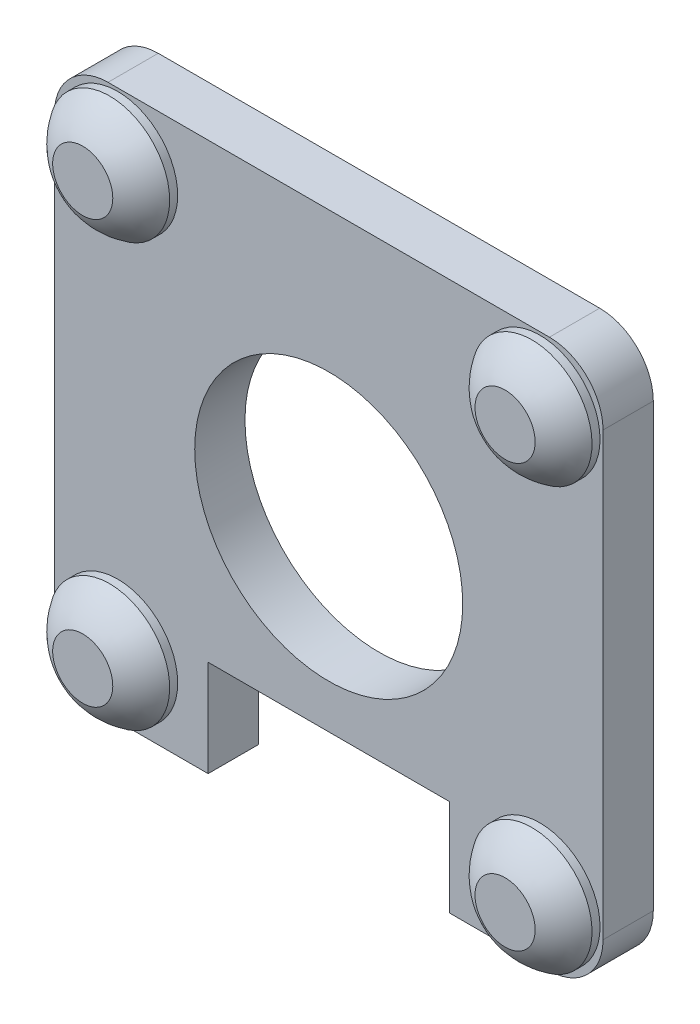
ISO-10303-21;
HEADER;
FILE_DESCRIPTION(('STEP AP214'),'2;1');
FILE_NAME('part.step','',(''),(''),'','','');
FILE_SCHEMA(('AUTOMOTIVE_DESIGN { 1 0 10303 214 1 1 1 1 }'));
ENDSEC;
DATA;
#1=APPLICATION_CONTEXT('core data for automotive mechanical design processes');
#2=APPLICATION_PROTOCOL_DEFINITION('international standard','automotive_design',2000,#1);
#3=PRODUCT_CONTEXT('',#1,'mechanical');
#4=PRODUCT('Part','Part','',(#3));
#5=PRODUCT_RELATED_PRODUCT_CATEGORY('part','',(#4));
#6=PRODUCT_DEFINITION_FORMATION('','',#4);
#7=PRODUCT_DEFINITION_CONTEXT('part definition',#1,'design');
#8=PRODUCT_DEFINITION('design','',#6,#7);
#9=PRODUCT_DEFINITION_SHAPE('','',#8);
#10=(LENGTH_UNIT() NAMED_UNIT(*) SI_UNIT(.MILLI.,.METRE.));
#11=(NAMED_UNIT(*) PLANE_ANGLE_UNIT() SI_UNIT($,.RADIAN.));
#12=(NAMED_UNIT(*) SI_UNIT($,.STERADIAN.) SOLID_ANGLE_UNIT());
#13=UNCERTAINTY_MEASURE_WITH_UNIT(LENGTH_MEASURE(1.E-05),#10,'distance_accuracy_value','');
#14=(GEOMETRIC_REPRESENTATION_CONTEXT(3) GLOBAL_UNCERTAINTY_ASSIGNED_CONTEXT((#13)) GLOBAL_UNIT_ASSIGNED_CONTEXT((#10,
#11,#12)) REPRESENTATION_CONTEXT('',''));
#15=CARTESIAN_POINT('',(0.,0.,0.));
#16=DIRECTION('',(0.,0.,1.));
#17=DIRECTION('',(1.,0.,0.));
#18=AXIS2_PLACEMENT_3D('',#15,#16,#17);
#19=CARTESIAN_POINT('',(-13.,-13.,2.38125));
#20=DIRECTION('',(0.,1.,0.));
#21=DIRECTION('',(0.,0.,1.));
#22=AXIS2_PLACEMENT_3D('',#19,#20,#21);
#23=PLANE('',#22);
#24=DIRECTION('',(1.,0.,0.));
#25=VECTOR('',#24,1.);
#26=CARTESIAN_POINT('',(-13.,-13.,2.38125));
#27=LINE('',#26,#25);
#28=CARTESIAN_POINT('',(5.715,-13.,2.38125));
#29=VERTEX_POINT('',#28);
#30=CARTESIAN_POINT('',(10.46,-13.,2.38125));
#31=VERTEX_POINT('',#30);
#32=EDGE_CURVE('E186',#29,#31,#27,.T.);
#33=ORIENTED_EDGE('',*,*,#32,.F.);
#34=DIRECTION('',(0.,0.,1.));
#35=VECTOR('',#34,1.);
#36=CARTESIAN_POINT('',(5.715,-13.,0.));
#37=LINE('',#36,#35);
#38=CARTESIAN_POINT('',(5.715,-13.,0.));
#39=VERTEX_POINT('',#38);
#40=EDGE_CURVE('E123',#39,#29,#37,.T.);
#41=ORIENTED_EDGE('',*,*,#40,.F.);
#42=DIRECTION('',(1.,0.,0.));
#43=VECTOR('',#42,1.);
#44=CARTESIAN_POINT('',(-13.,-13.,0.));
#45=LINE('',#44,#43);
#46=CARTESIAN_POINT('',(10.46,-13.,0.));
#47=VERTEX_POINT('',#46);
#48=EDGE_CURVE('E174',#39,#47,#45,.T.);
#49=ORIENTED_EDGE('',*,*,#48,.T.);
#50=DIRECTION('',(0.,0.,-1.));
#51=VECTOR('',#50,1.);
#52=CARTESIAN_POINT('',(10.46,-13.,2.38125));
#53=LINE('',#52,#51);
#54=EDGE_CURVE('E211',#47,#31,#53,.F.);
#55=ORIENTED_EDGE('',*,*,#54,.T.);
#56=EDGE_LOOP('',(#33,#41,#49,#55));
#57=FACE_BOUND('',#56,.T.);
#58=ADVANCED_FACE('F16',(#57),#23,.F.);
#59=CARTESIAN_POINT('',(-13.,13.,2.38125));
#60=DIRECTION('',(1.,0.,0.));
#61=DIRECTION('',(0.,1.,0.));
#62=AXIS2_PLACEMENT_3D('',#59,#60,#61);
#63=PLANE('',#62);
#64=DIRECTION('',(0.,-1.,0.));
#65=VECTOR('',#64,1.);
#66=CARTESIAN_POINT('',(-13.,13.,0.));
#67=LINE('',#66,#65);
#68=CARTESIAN_POINT('',(-13.,10.46,0.));
#69=VERTEX_POINT('',#68);
#70=CARTESIAN_POINT('',(-13.,-10.46,0.));
#71=VERTEX_POINT('',#70);
#72=EDGE_CURVE('E171',#69,#71,#67,.T.);
#73=ORIENTED_EDGE('',*,*,#72,.T.);
#74=DIRECTION('',(0.,0.,-1.));
#75=VECTOR('',#74,1.);
#76=CARTESIAN_POINT('',(-13.,-10.46,2.38125));
#77=LINE('',#76,#75);
#78=CARTESIAN_POINT('',(-13.,-10.46,2.38125));
#79=VERTEX_POINT('',#78);
#80=EDGE_CURVE('E225',#71,#79,#77,.F.);
#81=ORIENTED_EDGE('',*,*,#80,.T.);
#82=DIRECTION('',(0.,-1.,0.));
#83=VECTOR('',#82,1.);
#84=CARTESIAN_POINT('',(-13.,13.,2.38125));
#85=LINE('',#84,#83);
#86=CARTESIAN_POINT('',(-13.,10.46,2.38125));
#87=VERTEX_POINT('',#86);
#88=EDGE_CURVE('E183',#87,#79,#85,.T.);
#89=ORIENTED_EDGE('',*,*,#88,.F.);
#90=DIRECTION('',(0.,0.,-1.));
#91=VECTOR('',#90,1.);
#92=CARTESIAN_POINT('',(-13.,10.46,2.38125));
#93=LINE('',#92,#91);
#94=EDGE_CURVE('E222',#87,#69,#93,.T.);
#95=ORIENTED_EDGE('',*,*,#94,.T.);
#96=EDGE_LOOP('',(#73,#81,#89,#95));
#97=FACE_BOUND('',#96,.T.);
#98=ADVANCED_FACE('F18',(#97),#63,.F.);
#99=CARTESIAN_POINT('',(-10.46,-13.,0.));
#100=VERTEX_POINT('',#99);
#101=CARTESIAN_POINT('',(-5.715,-13.,0.));
#102=VERTEX_POINT('',#101);
#103=EDGE_CURVE('E175',#100,#102,#45,.T.);
#104=ORIENTED_EDGE('',*,*,#103,.T.);
#105=DIRECTION('',(0.,0.,1.));
#106=VECTOR('',#105,1.);
#107=CARTESIAN_POINT('',(-5.715,-13.,0.));
#108=LINE('',#107,#106);
#109=CARTESIAN_POINT('',(-5.715,-13.,2.38125));
#110=VERTEX_POINT('',#109);
#111=EDGE_CURVE('E140',#102,#110,#108,.T.);
#112=ORIENTED_EDGE('',*,*,#111,.T.);
#113=CARTESIAN_POINT('',(-10.46,-13.,2.38125));
#114=VERTEX_POINT('',#113);
#115=EDGE_CURVE('E187',#114,#110,#27,.T.);
#116=ORIENTED_EDGE('',*,*,#115,.F.);
#117=DIRECTION('',(0.,0.,-1.));
#118=VECTOR('',#117,1.);
#119=CARTESIAN_POINT('',(-10.46,-13.,2.38125));
#120=LINE('',#119,#118);
#121=EDGE_CURVE('E208',#114,#100,#120,.T.);
#122=ORIENTED_EDGE('',*,*,#121,.T.);
#123=EDGE_LOOP('',(#104,#112,#116,#122));
#124=FACE_BOUND('',#123,.T.);
#125=ADVANCED_FACE('F277',(#124),#23,.F.);
#126=CARTESIAN_POINT('',(13.,13.,2.38125));
#127=DIRECTION('',(-1.,0.,0.));
#128=DIRECTION('',(0.,-1.,0.));
#129=AXIS2_PLACEMENT_3D('',#126,#127,#128);
#130=PLANE('',#129);
#131=DIRECTION('',(0.,1.,0.));
#132=VECTOR('',#131,1.);
#133=CARTESIAN_POINT('',(13.,13.,2.38125));
#134=LINE('',#133,#132);
#135=CARTESIAN_POINT('',(13.,-10.46,2.38125));
#136=VERTEX_POINT('',#135);
#137=CARTESIAN_POINT('',(13.,10.46,2.38125));
#138=VERTEX_POINT('',#137);
#139=EDGE_CURVE('E189',#136,#138,#134,.T.);
#140=ORIENTED_EDGE('',*,*,#139,.F.);
#141=DIRECTION('',(0.,0.,-1.));
#142=VECTOR('',#141,1.);
#143=CARTESIAN_POINT('',(13.,-10.46,2.38125));
#144=LINE('',#143,#142);
#145=CARTESIAN_POINT('',(13.,-10.46,0.));
#146=VERTEX_POINT('',#145);
#147=EDGE_CURVE('E196',#136,#146,#144,.T.);
#148=ORIENTED_EDGE('',*,*,#147,.T.);
#149=DIRECTION('',(0.,1.,0.));
#150=VECTOR('',#149,1.);
#151=CARTESIAN_POINT('',(13.,13.,0.));
#152=LINE('',#151,#150);
#153=CARTESIAN_POINT('',(13.,10.46,0.));
#154=VERTEX_POINT('',#153);
#155=EDGE_CURVE('E178',#146,#154,#152,.T.);
#156=ORIENTED_EDGE('',*,*,#155,.T.);
#157=DIRECTION('',(0.,0.,-1.));
#158=VECTOR('',#157,1.);
#159=CARTESIAN_POINT('',(13.,10.46,2.38125));
#160=LINE('',#159,#158);
#161=EDGE_CURVE('E194',#154,#138,#160,.F.);
#162=ORIENTED_EDGE('',*,*,#161,.T.);
#163=EDGE_LOOP('',(#140,#148,#156,#162));
#164=FACE_BOUND('',#163,.T.);
#165=ADVANCED_FACE('F284',(#164),#130,.F.);
#166=CARTESIAN_POINT('',(-13.,13.,2.38125));
#167=DIRECTION('',(0.,-1.,0.));
#168=DIRECTION('',(0.,0.,-1.));
#169=AXIS2_PLACEMENT_3D('',#166,#167,#168);
#170=PLANE('',#169);
#171=DIRECTION('',(-1.,0.,0.));
#172=VECTOR('',#171,1.);
#173=CARTESIAN_POINT('',(-13.,13.,0.));
#174=LINE('',#173,#172);
#175=CARTESIAN_POINT('',(10.46,13.,0.));
#176=VERTEX_POINT('',#175);
#177=CARTESIAN_POINT('',(-10.46,13.,0.));
#178=VERTEX_POINT('',#177);
#179=EDGE_CURVE('E181',#176,#178,#174,.T.);
#180=ORIENTED_EDGE('',*,*,#179,.T.);
#181=DIRECTION('',(0.,0.,-1.));
#182=VECTOR('',#181,1.);
#183=CARTESIAN_POINT('',(-10.46,13.,2.38125));
#184=LINE('',#183,#182);
#185=CARTESIAN_POINT('',(-10.46,13.,2.38125));
#186=VERTEX_POINT('',#185);
#187=EDGE_CURVE('E39',#178,#186,#184,.F.);
#188=ORIENTED_EDGE('',*,*,#187,.T.);
#189=DIRECTION('',(-1.,0.,0.));
#190=VECTOR('',#189,1.);
#191=CARTESIAN_POINT('',(-13.,13.,2.38125));
#192=LINE('',#191,#190);
#193=CARTESIAN_POINT('',(10.46,13.,2.38125));
#194=VERTEX_POINT('',#193);
#195=EDGE_CURVE('E192',#194,#186,#192,.T.);
#196=ORIENTED_EDGE('',*,*,#195,.F.);
#197=DIRECTION('',(0.,0.,-1.));
#198=VECTOR('',#197,1.);
#199=CARTESIAN_POINT('',(10.46,13.,2.38125));
#200=LINE('',#199,#198);
#201=EDGE_CURVE('E227',#194,#176,#200,.T.);
#202=ORIENTED_EDGE('',*,*,#201,.T.);
#203=EDGE_LOOP('',(#180,#188,#196,#202));
#204=FACE_BOUND('',#203,.T.);
#205=ADVANCED_FACE('F247',(#204),#170,.F.);
#206=CARTESIAN_POINT('',(-13.,-13.,2.38125));
#207=DIRECTION('',(0.,0.,1.));
#208=DIRECTION('',(1.,0.,0.));
#209=AXIS2_PLACEMENT_3D('',#206,#207,#208);
#210=PLANE('',#209);
#211=DIRECTION('',(0.,1.,0.));
#212=VECTOR('',#211,1.);
#213=CARTESIAN_POINT('',(5.715,-13.,2.38125));
#214=LINE('',#213,#212);
#215=CARTESIAN_POINT('',(5.715,-8.428,2.38125));
#216=VERTEX_POINT('',#215);
#217=EDGE_CURVE('E120',#29,#216,#214,.T.);
#218=ORIENTED_EDGE('',*,*,#217,.F.);
#219=ORIENTED_EDGE('',*,*,#32,.T.);
#220=CARTESIAN_POINT('',(10.46,-10.46,2.38125));
#221=DIRECTION('',(0.,0.,1.));
#222=DIRECTION('',(1.,0.,0.));
#223=AXIS2_PLACEMENT_3D('',#220,#221,#222);
#224=CIRCLE('',#223,2.54);
#225=EDGE_CURVE('E220',#31,#136,#224,.T.);
#226=ORIENTED_EDGE('',*,*,#225,.T.);
#227=ORIENTED_EDGE('',*,*,#139,.T.);
#228=CARTESIAN_POINT('',(10.46,10.46,2.38125));
#229=DIRECTION('',(0.,0.,1.));
#230=DIRECTION('',(1.,0.,0.));
#231=AXIS2_PLACEMENT_3D('',#228,#229,#230);
#232=CIRCLE('',#231,2.54);
#233=EDGE_CURVE('E214',#138,#194,#232,.T.);
#234=ORIENTED_EDGE('',*,*,#233,.T.);
#235=ORIENTED_EDGE('',*,*,#195,.T.);
#236=CARTESIAN_POINT('',(-10.46,10.46,2.38125));
#237=DIRECTION('',(0.,0.,1.));
#238=DIRECTION('',(1.,0.,0.));
#239=AXIS2_PLACEMENT_3D('',#236,#237,#238);
#240=CIRCLE('',#239,2.54);
#241=EDGE_CURVE('E216',#186,#87,#240,.T.);
#242=ORIENTED_EDGE('',*,*,#241,.T.);
#243=ORIENTED_EDGE('',*,*,#88,.T.);
#244=CARTESIAN_POINT('',(-10.46,-10.46,2.38125));
#245=DIRECTION('',(0.,0.,1.));
#246=DIRECTION('',(1.,0.,0.));
#247=AXIS2_PLACEMENT_3D('',#244,#245,#246);
#248=CIRCLE('',#247,2.54);
#249=EDGE_CURVE('E218',#79,#114,#248,.T.);
#250=ORIENTED_EDGE('',*,*,#249,.T.);
#251=ORIENTED_EDGE('',*,*,#115,.T.);
#252=DIRECTION('',(0.,-1.,0.));
#253=VECTOR('',#252,1.);
#254=CARTESIAN_POINT('',(-5.715,-13.,2.38125));
#255=LINE('',#254,#253);
#256=CARTESIAN_POINT('',(-5.715,-8.428,2.38125));
#257=VERTEX_POINT('',#256);
#258=EDGE_CURVE('E130',#257,#110,#255,.T.);
#259=ORIENTED_EDGE('',*,*,#258,.F.);
#260=DIRECTION('',(-1.,0.,0.));
#261=VECTOR('',#260,1.);
#262=CARTESIAN_POINT('',(5.715,-8.428,2.38125));
#263=LINE('',#262,#261);
#264=EDGE_CURVE('E111',#216,#257,#263,.T.);
#265=ORIENTED_EDGE('',*,*,#264,.F.);
#266=EDGE_LOOP('',(#218,#219,#226,#227,#234,#235,#242,#243,#250,#251,#259,#265));
#267=FACE_BOUND('',#266,.T.);
#268=CARTESIAN_POINT('',(10.0075999999999,10.0076000000001,2.38125));
#269=DIRECTION('',(0.,0.,1.));
#270=DIRECTION('',(1.,0.,0.));
#271=AXIS2_PLACEMENT_3D('',#268,#269,#270);
#272=CIRCLE('',#271,2.85);
#273=CARTESIAN_POINT('',(12.8575999999999,10.0076000000001,2.38125));
#274=VERTEX_POINT('',#273);
#275=EDGE_CURVE('E11',#274,#274,#272,.T.);
#276=ORIENTED_EDGE('',*,*,#275,.F.);
#277=EDGE_LOOP('',(#276));
#278=FACE_BOUND('',#277,.T.);
#279=CARTESIAN_POINT('',(10.0076000000001,-10.0075999999999,2.38125));
#280=DIRECTION('',(0.,0.,1.));
#281=DIRECTION('',(1.,0.,0.));
#282=AXIS2_PLACEMENT_3D('',#279,#280,#281);
#283=CIRCLE('',#282,2.85);
#284=CARTESIAN_POINT('',(12.8576000000001,-10.0075999999999,2.38125));
#285=VERTEX_POINT('',#284);
#286=EDGE_CURVE('E24',#285,#285,#283,.T.);
#287=ORIENTED_EDGE('',*,*,#286,.F.);
#288=EDGE_LOOP('',(#287));
#289=FACE_BOUND('',#288,.T.);
#290=CARTESIAN_POINT('',(-10.0076,-10.0076,2.38125));
#291=DIRECTION('',(0.,0.,1.));
#292=DIRECTION('',(1.,0.,0.));
#293=AXIS2_PLACEMENT_3D('',#290,#291,#292);
#294=CIRCLE('',#293,2.85);
#295=CARTESIAN_POINT('',(-7.15759999999997,-10.0076,2.38125));
#296=VERTEX_POINT('',#295);
#297=EDGE_CURVE('E236',#296,#296,#294,.T.);
#298=ORIENTED_EDGE('',*,*,#297,.F.);
#299=EDGE_LOOP('',(#298));
#300=FACE_BOUND('',#299,.T.);
#301=CARTESIAN_POINT('',(-10.0076,10.0076,2.38125));
#302=DIRECTION('',(0.,0.,1.));
#303=DIRECTION('',(1.,0.,0.));
#304=AXIS2_PLACEMENT_3D('',#301,#302,#303);
#305=CIRCLE('',#304,2.85);
#306=CARTESIAN_POINT('',(-7.1576,10.0076,2.38125));
#307=VERTEX_POINT('',#306);
#308=EDGE_CURVE('E231',#307,#307,#305,.T.);
#309=ORIENTED_EDGE('',*,*,#308,.F.);
#310=EDGE_LOOP('',(#309));
#311=FACE_BOUND('',#310,.T.);
#312=CARTESIAN_POINT('',(0.,0.,2.38125));
#313=DIRECTION('',(0.,0.,1.));
#314=DIRECTION('',(1.,0.,0.));
#315=AXIS2_PLACEMENT_3D('',#312,#313,#314);
#316=CIRCLE('',#315,6.35);
#317=CARTESIAN_POINT('',(6.35,0.,2.38125));
#318=VERTEX_POINT('',#317);
#319=EDGE_CURVE('E167',#318,#318,#316,.T.);
#320=ORIENTED_EDGE('',*,*,#319,.F.);
#321=EDGE_LOOP('',(#320));
#322=FACE_BOUND('',#321,.T.);
#323=ADVANCED_FACE('F127',(#267,#278,#289,#300,#311,#322),#210,.T.);
#324=CARTESIAN_POINT('',(-13.,-13.,0.));
#325=DIRECTION('',(0.,0.,1.));
#326=DIRECTION('',(1.,0.,0.));
#327=AXIS2_PLACEMENT_3D('',#324,#325,#326);
#328=PLANE('',#327);
#329=ORIENTED_EDGE('',*,*,#48,.F.);
#330=DIRECTION('',(0.,1.,0.));
#331=VECTOR('',#330,1.);
#332=CARTESIAN_POINT('',(5.715,-13.,0.));
#333=LINE('',#332,#331);
#334=CARTESIAN_POINT('',(5.715,-8.428,0.));
#335=VERTEX_POINT('',#334);
#336=EDGE_CURVE('E132',#39,#335,#333,.T.);
#337=ORIENTED_EDGE('',*,*,#336,.T.);
#338=DIRECTION('',(-1.,0.,0.));
#339=VECTOR('',#338,1.);
#340=CARTESIAN_POINT('',(5.715,-8.428,0.));
#341=LINE('',#340,#339);
#342=CARTESIAN_POINT('',(-5.715,-8.428,0.));
#343=VERTEX_POINT('',#342);
#344=EDGE_CURVE('E114',#335,#343,#341,.T.);
#345=ORIENTED_EDGE('',*,*,#344,.T.);
#346=DIRECTION('',(0.,-1.,0.));
#347=VECTOR('',#346,1.);
#348=CARTESIAN_POINT('',(-5.715,-13.,0.));
#349=LINE('',#348,#347);
#350=EDGE_CURVE('E31',#343,#102,#349,.T.);
#351=ORIENTED_EDGE('',*,*,#350,.T.);
#352=ORIENTED_EDGE('',*,*,#103,.F.);
#353=CARTESIAN_POINT('',(-10.46,-10.46,0.));
#354=DIRECTION('',(0.,0.,1.));
#355=DIRECTION('',(1.,0.,0.));
#356=AXIS2_PLACEMENT_3D('',#353,#354,#355);
#357=CIRCLE('',#356,2.54);
#358=EDGE_CURVE('E203',#100,#71,#357,.F.);
#359=ORIENTED_EDGE('',*,*,#358,.T.);
#360=ORIENTED_EDGE('',*,*,#72,.F.);
#361=CARTESIAN_POINT('',(-10.46,10.46,0.));
#362=DIRECTION('',(0.,0.,1.));
#363=DIRECTION('',(1.,0.,0.));
#364=AXIS2_PLACEMENT_3D('',#361,#362,#363);
#365=CIRCLE('',#364,2.54);
#366=EDGE_CURVE('E201',#69,#178,#365,.F.);
#367=ORIENTED_EDGE('',*,*,#366,.T.);
#368=ORIENTED_EDGE('',*,*,#179,.F.);
#369=CARTESIAN_POINT('',(10.46,10.46,0.));
#370=DIRECTION('',(0.,0.,1.));
#371=DIRECTION('',(1.,0.,0.));
#372=AXIS2_PLACEMENT_3D('',#369,#370,#371);
#373=CIRCLE('',#372,2.54);
#374=EDGE_CURVE('E199',#176,#154,#373,.F.);
#375=ORIENTED_EDGE('',*,*,#374,.T.);
#376=ORIENTED_EDGE('',*,*,#155,.F.);
#377=CARTESIAN_POINT('',(10.46,-10.46,0.));
#378=DIRECTION('',(0.,0.,1.));
#379=DIRECTION('',(1.,0.,0.));
#380=AXIS2_PLACEMENT_3D('',#377,#378,#379);
#381=CIRCLE('',#380,2.54);
#382=EDGE_CURVE('E205',#146,#47,#381,.F.);
#383=ORIENTED_EDGE('',*,*,#382,.T.);
#384=EDGE_LOOP('',(#329,#337,#345,#351,#352,#359,#360,#367,#368,#375,#376,#383));
#385=FACE_BOUND('',#384,.T.);
#386=CARTESIAN_POINT('',(0.,0.,0.));
#387=DIRECTION('',(0.,0.,1.));
#388=DIRECTION('',(1.,0.,0.));
#389=AXIS2_PLACEMENT_3D('',#386,#387,#388);
#390=CIRCLE('',#389,6.35);
#391=CARTESIAN_POINT('',(6.35,0.,0.));
#392=VERTEX_POINT('',#391);
#393=EDGE_CURVE('E170',#392,#392,#390,.T.);
#394=ORIENTED_EDGE('',*,*,#393,.T.);
#395=EDGE_LOOP('',(#394));
#396=FACE_BOUND('',#395,.T.);
#397=ADVANCED_FACE('F246',(#385,#396),#328,.F.);
#398=CARTESIAN_POINT('',(10.46,-10.46,2.38125));
#399=DIRECTION('',(0.,0.,-1.));
#400=DIRECTION('',(-1.,0.,0.));
#401=AXIS2_PLACEMENT_3D('',#398,#399,#400);
#402=CYLINDRICAL_SURFACE('',#401,2.54);
#403=ORIENTED_EDGE('',*,*,#225,.F.);
#404=ORIENTED_EDGE('',*,*,#54,.F.);
#405=ORIENTED_EDGE('',*,*,#382,.F.);
#406=ORIENTED_EDGE('',*,*,#147,.F.);
#407=EDGE_LOOP('',(#403,#404,#405,#406));
#408=FACE_BOUND('',#407,.T.);
#409=ADVANCED_FACE('F264',(#408),#402,.T.);
#410=CARTESIAN_POINT('',(-10.46,-10.46,2.38125));
#411=DIRECTION('',(0.,0.,-1.));
#412=DIRECTION('',(-1.,0.,0.));
#413=AXIS2_PLACEMENT_3D('',#410,#411,#412);
#414=CYLINDRICAL_SURFACE('',#413,2.54);
#415=ORIENTED_EDGE('',*,*,#249,.F.);
#416=ORIENTED_EDGE('',*,*,#80,.F.);
#417=ORIENTED_EDGE('',*,*,#358,.F.);
#418=ORIENTED_EDGE('',*,*,#121,.F.);
#419=EDGE_LOOP('',(#415,#416,#417,#418));
#420=FACE_BOUND('',#419,.T.);
#421=ADVANCED_FACE('F271',(#420),#414,.T.);
#422=CARTESIAN_POINT('',(-10.46,10.46,2.38125));
#423=DIRECTION('',(0.,0.,-1.));
#424=DIRECTION('',(-1.,0.,0.));
#425=AXIS2_PLACEMENT_3D('',#422,#423,#424);
#426=CYLINDRICAL_SURFACE('',#425,2.54);
#427=ORIENTED_EDGE('',*,*,#241,.F.);
#428=ORIENTED_EDGE('',*,*,#187,.F.);
#429=ORIENTED_EDGE('',*,*,#366,.F.);
#430=ORIENTED_EDGE('',*,*,#94,.F.);
#431=EDGE_LOOP('',(#427,#428,#429,#430));
#432=FACE_BOUND('',#431,.T.);
#433=ADVANCED_FACE('F307',(#432),#426,.T.);
#434=CARTESIAN_POINT('',(10.46,10.46,2.38125));
#435=DIRECTION('',(0.,0.,-1.));
#436=DIRECTION('',(-1.,0.,0.));
#437=AXIS2_PLACEMENT_3D('',#434,#435,#436);
#438=CYLINDRICAL_SURFACE('',#437,2.54);
#439=ORIENTED_EDGE('',*,*,#233,.F.);
#440=ORIENTED_EDGE('',*,*,#161,.F.);
#441=ORIENTED_EDGE('',*,*,#374,.F.);
#442=ORIENTED_EDGE('',*,*,#201,.F.);
#443=EDGE_LOOP('',(#439,#440,#441,#442));
#444=FACE_BOUND('',#443,.T.);
#445=ADVANCED_FACE('F259',(#444),#438,.T.);
#446=CARTESIAN_POINT('',(0.,0.,2.38125));
#447=DIRECTION('',(0.,0.,1.));
#448=DIRECTION('',(1.,0.,0.));
#449=AXIS2_PLACEMENT_3D('',#446,#447,#448);
#450=CYLINDRICAL_SURFACE('',#449,6.35);
#451=ORIENTED_EDGE('',*,*,#319,.T.);
#452=EDGE_LOOP('',(#451));
#453=FACE_BOUND('',#452,.T.);
#454=ORIENTED_EDGE('',*,*,#393,.F.);
#455=EDGE_LOOP('',(#454));
#456=FACE_BOUND('',#455,.T.);
#457=ADVANCED_FACE('F255',(#453,#456),#450,.F.);
#458=CARTESIAN_POINT('',(-10.0076,10.0076,3.05592788418123));
#459=DIRECTION('',(0.,0.,1.));
#460=DIRECTION('',(1.,0.,0.));
#461=AXIS2_PLACEMENT_3D('',#458,#459,#460);
#462=CYLINDRICAL_SURFACE('',#461,2.85);
#463=ORIENTED_EDGE('',*,*,#308,.T.);
#464=EDGE_LOOP('',(#463));
#465=FACE_BOUND('',#464,.T.);
#466=CARTESIAN_POINT('',(-10.0076,10.0076,2.76125));
#467=DIRECTION('',(0.,0.,1.));
#468=DIRECTION('',(1.,0.,0.));
#469=AXIS2_PLACEMENT_3D('',#466,#467,#468);
#470=CIRCLE('',#469,2.85);
#471=CARTESIAN_POINT('',(-7.1576,10.0076,2.76125));
#472=VERTEX_POINT('',#471);
#473=EDGE_CURVE('E164',#472,#472,#470,.T.);
#474=ORIENTED_EDGE('',*,*,#473,.F.);
#475=EDGE_LOOP('',(#474));
#476=FACE_BOUND('',#475,.T.);
#477=ADVANCED_FACE('F258',(#465,#476),#462,.T.);
#478=CARTESIAN_POINT('',(-10.0076,10.0076,0.998676056553111));
#479=DIRECTION('',(0.,0.,1.));
#480=DIRECTION('',(1.,0.,0.));
#481=AXIS2_PLACEMENT_3D('',#478,#479,#480);
#482=DEGENERATE_TOROIDAL_SURFACE('',#481,0.000714801278911895,3.350387,.T.);
#483=ORIENTED_EDGE('',*,*,#473,.T.);
#484=EDGE_LOOP('',(#483));
#485=FACE_BOUND('',#484,.T.);
#486=CARTESIAN_POINT('',(-10.0076,10.0076,4.03125));
#487=DIRECTION('',(0.,0.,1.));
#488=DIRECTION('',(1.,0.,0.));
#489=AXIS2_PLACEMENT_3D('',#486,#487,#488);
#490=CIRCLE('',#489,1.425);
#491=CARTESIAN_POINT('',(-8.5826,10.0076,4.03125));
#492=VERTEX_POINT('',#491);
#493=EDGE_CURVE('E161',#492,#492,#490,.T.);
#494=ORIENTED_EDGE('',*,*,#493,.F.);
#495=EDGE_LOOP('',(#494));
#496=FACE_BOUND('',#495,.T.);
#497=ADVANCED_FACE('F323',(#485,#496),#482,.T.);
#498=CARTESIAN_POINT('',(-8.5826,10.0076,4.03125));
#499=DIRECTION('',(0.,0.,1.));
#500=DIRECTION('',(1.,0.,0.));
#501=AXIS2_PLACEMENT_3D('',#498,#499,#500);
#502=PLANE('',#501);
#503=ORIENTED_EDGE('',*,*,#493,.T.);
#504=EDGE_LOOP('',(#503));
#505=FACE_BOUND('',#504,.T.);
#506=ADVANCED_FACE('F327',(#505),#502,.T.);
#507=CARTESIAN_POINT('',(-10.0076,-10.0076,3.05592788418123));
#508=DIRECTION('',(0.,0.,1.));
#509=DIRECTION('',(0.,1.,0.));
#510=AXIS2_PLACEMENT_3D('',#507,#508,#509);
#511=CYLINDRICAL_SURFACE('',#510,2.85);
#512=ORIENTED_EDGE('',*,*,#297,.T.);
#513=EDGE_LOOP('',(#512));
#514=FACE_BOUND('',#513,.T.);
#515=CARTESIAN_POINT('',(-10.0076,-10.0076,2.76125));
#516=DIRECTION('',(0.,0.,1.));
#517=DIRECTION('',(0.,1.,0.));
#518=AXIS2_PLACEMENT_3D('',#515,#516,#517);
#519=CIRCLE('',#518,2.85);
#520=CARTESIAN_POINT('',(-10.0076,-7.15760000000004,2.76125));
#521=VERTEX_POINT('',#520);
#522=EDGE_CURVE('E158',#521,#521,#519,.T.);
#523=ORIENTED_EDGE('',*,*,#522,.F.);
#524=EDGE_LOOP('',(#523));
#525=FACE_BOUND('',#524,.T.);
#526=ADVANCED_FACE('F331',(#514,#525),#511,.T.);
#527=CARTESIAN_POINT('',(-10.0076,-10.0076,0.998676056553111));
#528=DIRECTION('',(0.,0.,1.));
#529=DIRECTION('',(0.,1.,0.));
#530=AXIS2_PLACEMENT_3D('',#527,#528,#529);
#531=DEGENERATE_TOROIDAL_SURFACE('',#530,0.000714801278911895,3.350387,.T.);
#532=ORIENTED_EDGE('',*,*,#522,.T.);
#533=EDGE_LOOP('',(#532));
#534=FACE_BOUND('',#533,.T.);
#535=CARTESIAN_POINT('',(-10.0076,-10.0076,4.03125));
#536=DIRECTION('',(0.,0.,1.));
#537=DIRECTION('',(0.,1.,0.));
#538=AXIS2_PLACEMENT_3D('',#535,#536,#537);
#539=CIRCLE('',#538,1.425);
#540=CARTESIAN_POINT('',(-10.0076,-8.58260000000003,4.03125));
#541=VERTEX_POINT('',#540);
#542=EDGE_CURVE('E155',#541,#541,#539,.T.);
#543=ORIENTED_EDGE('',*,*,#542,.F.);
#544=EDGE_LOOP('',(#543));
#545=FACE_BOUND('',#544,.T.);
#546=ADVANCED_FACE('F335',(#534,#545),#531,.T.);
#547=CARTESIAN_POINT('',(-10.0076,-8.58260000000003,4.03125));
#548=DIRECTION('',(0.,0.,1.));
#549=DIRECTION('',(0.,1.,0.));
#550=AXIS2_PLACEMENT_3D('',#547,#548,#549);
#551=PLANE('',#550);
#552=ORIENTED_EDGE('',*,*,#542,.T.);
#553=EDGE_LOOP('',(#552));
#554=FACE_BOUND('',#553,.T.);
#555=ADVANCED_FACE('F339',(#554),#551,.T.);
#556=CARTESIAN_POINT('',(10.0076000000001,-10.0075999999999,3.05592788418123));
#557=DIRECTION('',(0.,0.,1.));
#558=DIRECTION('',(-1.,0.,0.));
#559=AXIS2_PLACEMENT_3D('',#556,#557,#558);
#560=CYLINDRICAL_SURFACE('',#559,2.85);
#561=ORIENTED_EDGE('',*,*,#286,.T.);
#562=EDGE_LOOP('',(#561));
#563=FACE_BOUND('',#562,.T.);
#564=CARTESIAN_POINT('',(10.0076000000001,-10.0075999999999,2.76125));
#565=DIRECTION('',(0.,0.,1.));
#566=DIRECTION('',(-1.,0.,0.));
#567=AXIS2_PLACEMENT_3D('',#564,#565,#566);
#568=CIRCLE('',#567,2.85);
#569=CARTESIAN_POINT('',(7.15760000000007,-10.0076,2.76125));
#570=VERTEX_POINT('',#569);
#571=EDGE_CURVE('E152',#570,#570,#568,.T.);
#572=ORIENTED_EDGE('',*,*,#571,.F.);
#573=EDGE_LOOP('',(#572));
#574=FACE_BOUND('',#573,.T.);
#575=ADVANCED_FACE('F241',(#563,#574),#560,.T.);
#576=CARTESIAN_POINT('',(10.0076000000001,-10.0075999999999,0.998676056553111));
#577=DIRECTION('',(0.,0.,1.));
#578=DIRECTION('',(-1.,0.,0.));
#579=AXIS2_PLACEMENT_3D('',#576,#577,#578);
#580=DEGENERATE_TOROIDAL_SURFACE('',#579,0.000714801278911895,3.350387,.T.);
#581=ORIENTED_EDGE('',*,*,#571,.T.);
#582=EDGE_LOOP('',(#581));
#583=FACE_BOUND('',#582,.T.);
#584=CARTESIAN_POINT('',(10.0076000000001,-10.0075999999999,4.03125));
#585=DIRECTION('',(0.,0.,1.));
#586=DIRECTION('',(-1.,0.,0.));
#587=AXIS2_PLACEMENT_3D('',#584,#585,#586);
#588=CIRCLE('',#587,1.425);
#589=CARTESIAN_POINT('',(8.58260000000007,-10.0075999999999,4.03125));
#590=VERTEX_POINT('',#589);
#591=EDGE_CURVE('E149',#590,#590,#588,.T.);
#592=ORIENTED_EDGE('',*,*,#591,.F.);
#593=EDGE_LOOP('',(#592));
#594=FACE_BOUND('',#593,.T.);
#595=ADVANCED_FACE('F346',(#583,#594),#580,.T.);
#596=CARTESIAN_POINT('',(8.58260000000007,-10.0075999999999,4.03125));
#597=DIRECTION('',(0.,0.,1.));
#598=DIRECTION('',(-1.,0.,0.));
#599=AXIS2_PLACEMENT_3D('',#596,#597,#598);
#600=PLANE('',#599);
#601=ORIENTED_EDGE('',*,*,#591,.T.);
#602=EDGE_LOOP('',(#601));
#603=FACE_BOUND('',#602,.T.);
#604=ADVANCED_FACE('F349',(#603),#600,.T.);
#605=CARTESIAN_POINT('',(10.0075999999999,10.0076000000001,3.05592788418123));
#606=DIRECTION('',(0.,0.,1.));
#607=DIRECTION('',(0.,-1.,0.));
#608=AXIS2_PLACEMENT_3D('',#605,#606,#607);
#609=CYLINDRICAL_SURFACE('',#608,2.85);
#610=ORIENTED_EDGE('',*,*,#275,.T.);
#611=EDGE_LOOP('',(#610));
#612=FACE_BOUND('',#611,.T.);
#613=CARTESIAN_POINT('',(10.0075999999999,10.0076000000001,2.76125));
#614=DIRECTION('',(0.,0.,1.));
#615=DIRECTION('',(0.,-1.,0.));
#616=AXIS2_PLACEMENT_3D('',#613,#614,#615);
#617=CIRCLE('',#616,2.85);
#618=CARTESIAN_POINT('',(10.0075999999999,7.1576000000001,2.76125));
#619=VERTEX_POINT('',#618);
#620=EDGE_CURVE('E146',#619,#619,#617,.T.);
#621=ORIENTED_EDGE('',*,*,#620,.F.);
#622=EDGE_LOOP('',(#621));
#623=FACE_BOUND('',#622,.T.);
#624=ADVANCED_FACE('F353',(#612,#623),#609,.T.);
#625=CARTESIAN_POINT('',(10.0075999999999,10.0076000000001,0.998676056553111));
#626=DIRECTION('',(0.,0.,1.));
#627=DIRECTION('',(0.,-1.,0.));
#628=AXIS2_PLACEMENT_3D('',#625,#626,#627);
#629=DEGENERATE_TOROIDAL_SURFACE('',#628,0.000714801278911895,3.350387,.T.);
#630=ORIENTED_EDGE('',*,*,#620,.T.);
#631=EDGE_LOOP('',(#630));
#632=FACE_BOUND('',#631,.T.);
#633=CARTESIAN_POINT('',(10.0075999999999,10.0076000000001,4.03125));
#634=DIRECTION('',(0.,0.,1.));
#635=DIRECTION('',(0.,-1.,0.));
#636=AXIS2_PLACEMENT_3D('',#633,#634,#635);
#637=CIRCLE('',#636,1.425);
#638=CARTESIAN_POINT('',(10.0075999999999,8.5826000000001,4.03125));
#639=VERTEX_POINT('',#638);
#640=EDGE_CURVE('E139',#639,#639,#637,.T.);
#641=ORIENTED_EDGE('',*,*,#640,.F.);
#642=EDGE_LOOP('',(#641));
#643=FACE_BOUND('',#642,.T.);
#644=ADVANCED_FACE('F357',(#632,#643),#629,.T.);
#645=CARTESIAN_POINT('',(10.0075999999999,8.5826000000001,4.03125));
#646=DIRECTION('',(0.,0.,1.));
#647=DIRECTION('',(0.,-1.,0.));
#648=AXIS2_PLACEMENT_3D('',#645,#646,#647);
#649=PLANE('',#648);
#650=ORIENTED_EDGE('',*,*,#640,.T.);
#651=EDGE_LOOP('',(#650));
#652=FACE_BOUND('',#651,.T.);
#653=ADVANCED_FACE('F361',(#652),#649,.T.);
#654=CARTESIAN_POINT('',(5.715,-13.,0.));
#655=DIRECTION('',(1.,0.,0.));
#656=DIRECTION('',(0.,1.,0.));
#657=AXIS2_PLACEMENT_3D('',#654,#655,#656);
#658=PLANE('',#657);
#659=ORIENTED_EDGE('',*,*,#217,.T.);
#660=DIRECTION('',(0.,0.,1.));
#661=VECTOR('',#660,1.);
#662=CARTESIAN_POINT('',(5.715,-8.428,0.));
#663=LINE('',#662,#661);
#664=EDGE_CURVE('E107',#335,#216,#663,.T.);
#665=ORIENTED_EDGE('',*,*,#664,.F.);
#666=ORIENTED_EDGE('',*,*,#336,.F.);
#667=ORIENTED_EDGE('',*,*,#40,.T.);
#668=EDGE_LOOP('',(#659,#665,#666,#667));
#669=FACE_BOUND('',#668,.T.);
#670=ADVANCED_FACE('F121',(#669),#658,.F.);
#671=CARTESIAN_POINT('',(-5.715,-13.,0.));
#672=DIRECTION('',(-1.,0.,0.));
#673=DIRECTION('',(0.,0.,1.));
#674=AXIS2_PLACEMENT_3D('',#671,#672,#673);
#675=PLANE('',#674);
#676=ORIENTED_EDGE('',*,*,#258,.T.);
#677=ORIENTED_EDGE('',*,*,#111,.F.);
#678=ORIENTED_EDGE('',*,*,#350,.F.);
#679=DIRECTION('',(0.,0.,1.));
#680=VECTOR('',#679,1.);
#681=CARTESIAN_POINT('',(-5.715,-8.428,0.));
#682=LINE('',#681,#680);
#683=EDGE_CURVE('E117',#343,#257,#682,.T.);
#684=ORIENTED_EDGE('',*,*,#683,.T.);
#685=EDGE_LOOP('',(#676,#677,#678,#684));
#686=FACE_BOUND('',#685,.T.);
#687=ADVANCED_FACE('F368',(#686),#675,.F.);
#688=CARTESIAN_POINT('',(5.715,-8.428,0.));
#689=DIRECTION('',(0.,1.,0.));
#690=DIRECTION('',(-1.,0.,0.));
#691=AXIS2_PLACEMENT_3D('',#688,#689,#690);
#692=PLANE('',#691);
#693=ORIENTED_EDGE('',*,*,#264,.T.);
#694=ORIENTED_EDGE('',*,*,#683,.F.);
#695=ORIENTED_EDGE('',*,*,#344,.F.);
#696=ORIENTED_EDGE('',*,*,#664,.T.);
#697=EDGE_LOOP('',(#693,#694,#695,#696));
#698=FACE_BOUND('',#697,.T.);
#699=ADVANCED_FACE('F109',(#698),#692,.F.);
#700=CLOSED_SHELL('',(#58,#98,#125,#165,#205,#323,#397,#409,#421,#433,#445,#457,#477,#497,#506,
#526,#546,#555,#575,#595,#604,#624,#644,#653,#670,#687,#699));
#701=MANIFOLD_SOLID_BREP('B1',#700);
#702=ADVANCED_BREP_SHAPE_REPRESENTATION('',(#18,#701),#14);
#703=SHAPE_DEFINITION_REPRESENTATION(#9,#702);
ENDSEC;
END-ISO-10303-21;
